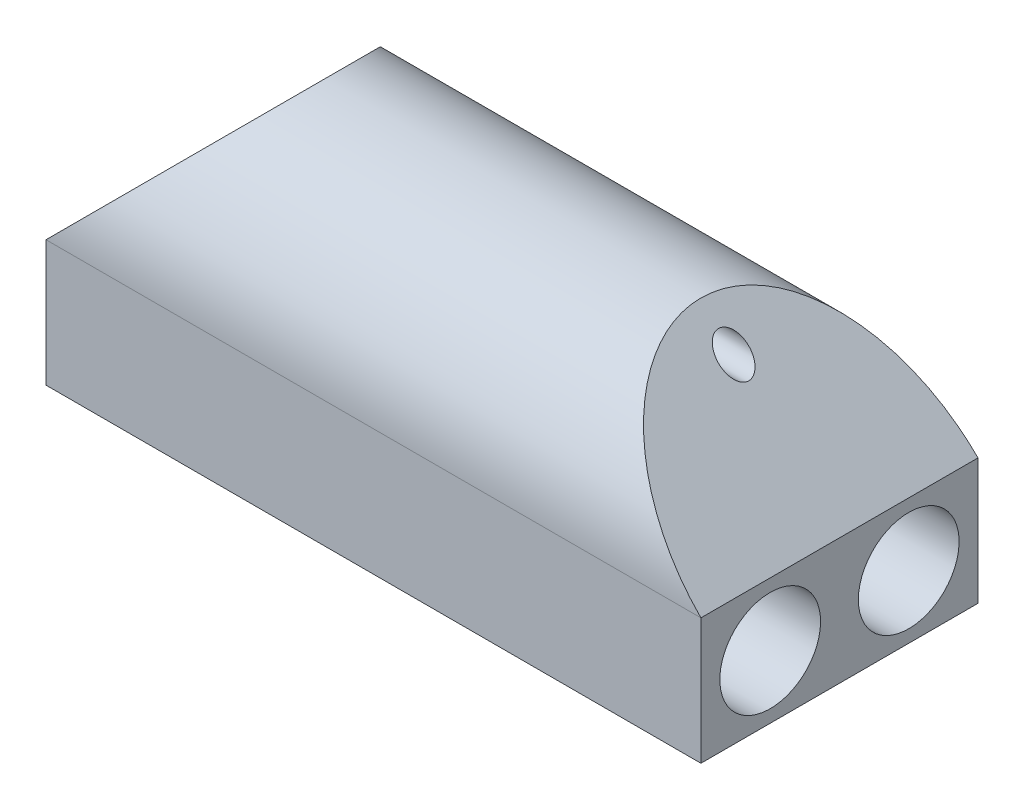
ISO-10303-21;
HEADER;
FILE_DESCRIPTION(('STEP AP214'),'2;1');
FILE_NAME('part.step','',(''),(''),'','','');
FILE_SCHEMA(('AUTOMOTIVE_DESIGN { 1 0 10303 214 1 1 1 1 }'));
ENDSEC;
DATA;
#1=APPLICATION_CONTEXT('core data for automotive mechanical design processes');
#2=APPLICATION_PROTOCOL_DEFINITION('international standard','automotive_design',2000,#1);
#3=PRODUCT_CONTEXT('',#1,'mechanical');
#4=PRODUCT('Part','Part','',(#3));
#5=PRODUCT_RELATED_PRODUCT_CATEGORY('part','',(#4));
#6=PRODUCT_DEFINITION_FORMATION('','',#4);
#7=PRODUCT_DEFINITION_CONTEXT('part definition',#1,'design');
#8=PRODUCT_DEFINITION('design','',#6,#7);
#9=PRODUCT_DEFINITION_SHAPE('','',#8);
#10=(LENGTH_UNIT() NAMED_UNIT(*) SI_UNIT(.MILLI.,.METRE.));
#11=(NAMED_UNIT(*) PLANE_ANGLE_UNIT() SI_UNIT($,.RADIAN.));
#12=(NAMED_UNIT(*) SI_UNIT($,.STERADIAN.) SOLID_ANGLE_UNIT());
#13=UNCERTAINTY_MEASURE_WITH_UNIT(LENGTH_MEASURE(1.E-05),#10,'distance_accuracy_value','');
#14=(GEOMETRIC_REPRESENTATION_CONTEXT(3) GLOBAL_UNCERTAINTY_ASSIGNED_CONTEXT((#13)) GLOBAL_UNIT_ASSIGNED_CONTEXT((#10,
#11,#12)) REPRESENTATION_CONTEXT('',''));
#15=CARTESIAN_POINT('',(0.,0.,0.));
#16=DIRECTION('',(0.,0.,1.));
#17=DIRECTION('',(1.,0.,0.));
#18=AXIS2_PLACEMENT_3D('',#15,#16,#17);
#19=CARTESIAN_POINT('',(0.,6.35,0.));
#20=DIRECTION('',(-1.,0.,0.));
#21=DIRECTION('',(0.,0.,1.));
#22=AXIS2_PLACEMENT_3D('',#19,#20,#21);
#23=PLANE('',#22);
#24=CARTESIAN_POINT('',(0.,3.175,-3.4925));
#25=DIRECTION('',(1.,0.,0.));
#26=DIRECTION('',(0.,0.,-1.));
#27=AXIS2_PLACEMENT_3D('',#24,#25,#26);
#28=CIRCLE('',#27,2.54);
#29=CARTESIAN_POINT('',(0.,3.175,-6.0325));
#30=VERTEX_POINT('',#29);
#31=EDGE_CURVE('E127',#30,#30,#28,.T.);
#32=ORIENTED_EDGE('',*,*,#31,.F.);
#33=EDGE_LOOP('',(#32));
#34=FACE_BOUND('',#33,.T.);
#35=CARTESIAN_POINT('',(0.,3.175,-10.4775));
#36=DIRECTION('',(1.,0.,0.));
#37=DIRECTION('',(0.,0.,1.));
#38=AXIS2_PLACEMENT_3D('',#35,#36,#37);
#39=CIRCLE('',#38,2.54);
#40=CARTESIAN_POINT('',(0.,3.175,-7.9375));
#41=VERTEX_POINT('',#40);
#42=EDGE_CURVE('E121',#41,#41,#39,.T.);
#43=ORIENTED_EDGE('',*,*,#42,.F.);
#44=EDGE_LOOP('',(#43));
#45=FACE_BOUND('',#44,.T.);
#46=DIRECTION('',(0.,-1.,0.));
#47=VECTOR('',#46,1.);
#48=CARTESIAN_POINT('',(0.,6.35,-13.97));
#49=LINE('',#48,#47);
#50=CARTESIAN_POINT('',(0.,6.35,-13.97));
#51=VERTEX_POINT('',#50);
#52=CARTESIAN_POINT('',(0.,0.,-13.97));
#53=VERTEX_POINT('',#52);
#54=EDGE_CURVE('E98',#51,#53,#49,.T.);
#55=ORIENTED_EDGE('',*,*,#54,.F.);
#56=DIRECTION('',(0.,0.,1.));
#57=VECTOR('',#56,1.);
#58=CARTESIAN_POINT('',(0.,6.35,-13.97));
#59=LINE('',#58,#57);
#60=CARTESIAN_POINT('',(0.,6.35,0.));
#61=VERTEX_POINT('',#60);
#62=EDGE_CURVE('E87',#51,#61,#59,.T.);
#63=ORIENTED_EDGE('',*,*,#62,.T.);
#64=DIRECTION('',(0.,-1.,0.));
#65=VECTOR('',#64,1.);
#66=CARTESIAN_POINT('',(0.,6.35,0.));
#67=LINE('',#66,#65);
#68=CARTESIAN_POINT('',(0.,0.,0.));
#69=VERTEX_POINT('',#68);
#70=EDGE_CURVE('E109',#61,#69,#67,.T.);
#71=ORIENTED_EDGE('',*,*,#70,.T.);
#72=DIRECTION('',(0.,0.,-1.));
#73=VECTOR('',#72,1.);
#74=CARTESIAN_POINT('',(0.,0.,0.));
#75=LINE('',#74,#73);
#76=EDGE_CURVE('E91',#69,#53,#75,.T.);
#77=ORIENTED_EDGE('',*,*,#76,.T.);
#78=EDGE_LOOP('',(#55,#63,#71,#77));
#79=FACE_BOUND('',#78,.T.);
#80=ADVANCED_FACE('F35',(#34,#45,#79),#23,.F.);
#81=CARTESIAN_POINT('',(0.,6.35,-13.97));
#82=DIRECTION('',(0.,0.,1.));
#83=DIRECTION('',(1.,0.,0.));
#84=AXIS2_PLACEMENT_3D('',#81,#82,#83);
#85=PLANE('',#84);
#86=DIRECTION('',(-1.,0.,0.));
#87=VECTOR('',#86,1.);
#88=CARTESIAN_POINT('',(0.,0.,-13.97));
#89=LINE('',#88,#87);
#90=CARTESIAN_POINT('',(-33.02,0.,-13.97));
#91=VERTEX_POINT('',#90);
#92=EDGE_CURVE('E113',#53,#91,#89,.T.);
#93=ORIENTED_EDGE('',*,*,#92,.T.);
#94=DIRECTION('',(0.,-1.,0.));
#95=VECTOR('',#94,1.);
#96=CARTESIAN_POINT('',(-33.02,6.35,-13.97));
#97=LINE('',#96,#95);
#98=CARTESIAN_POINT('',(-33.02,6.35,-13.97));
#99=VERTEX_POINT('',#98);
#100=EDGE_CURVE('E100',#99,#91,#97,.T.);
#101=ORIENTED_EDGE('',*,*,#100,.F.);
#102=DIRECTION('',(-1.,0.,0.));
#103=VECTOR('',#102,1.);
#104=CARTESIAN_POINT('',(0.,6.35,-13.97));
#105=LINE('',#104,#103);
#106=EDGE_CURVE('E82',#51,#99,#105,.T.);
#107=ORIENTED_EDGE('',*,*,#106,.F.);
#108=ORIENTED_EDGE('',*,*,#54,.T.);
#109=EDGE_LOOP('',(#93,#101,#107,#108));
#110=FACE_BOUND('',#109,.T.);
#111=ADVANCED_FACE('F97',(#110),#85,.F.);
#112=CARTESIAN_POINT('',(-33.02,6.35,0.));
#113=DIRECTION('',(1.,0.,0.));
#114=DIRECTION('',(0.,0.,-1.));
#115=AXIS2_PLACEMENT_3D('',#112,#113,#114);
#116=PLANE('',#115);
#117=CARTESIAN_POINT('',(-33.02,3.175,-3.4925));
#118=DIRECTION('',(1.,0.,0.));
#119=DIRECTION('',(0.,0.,-1.));
#120=AXIS2_PLACEMENT_3D('',#117,#118,#119);
#121=CIRCLE('',#120,2.54);
#122=CARTESIAN_POINT('',(-33.02,3.175,-6.0325));
#123=VERTEX_POINT('',#122);
#124=EDGE_CURVE('E130',#123,#123,#121,.T.);
#125=ORIENTED_EDGE('',*,*,#124,.T.);
#126=EDGE_LOOP('',(#125));
#127=FACE_BOUND('',#126,.T.);
#128=CARTESIAN_POINT('',(-33.02,3.175,-10.4775));
#129=DIRECTION('',(1.,0.,0.));
#130=DIRECTION('',(0.,0.,1.));
#131=AXIS2_PLACEMENT_3D('',#128,#129,#130);
#132=CIRCLE('',#131,2.54);
#133=CARTESIAN_POINT('',(-33.02,3.175,-7.9375));
#134=VERTEX_POINT('',#133);
#135=EDGE_CURVE('E124',#134,#134,#132,.T.);
#136=ORIENTED_EDGE('',*,*,#135,.T.);
#137=EDGE_LOOP('',(#136));
#138=FACE_BOUND('',#137,.T.);
#139=DIRECTION('',(0.,-1.,0.));
#140=VECTOR('',#139,1.);
#141=CARTESIAN_POINT('',(-33.02,6.35,0.));
#142=LINE('',#141,#140);
#143=CARTESIAN_POINT('',(-33.02,6.35,0.));
#144=VERTEX_POINT('',#143);
#145=CARTESIAN_POINT('',(-33.02,0.,0.));
#146=VERTEX_POINT('',#145);
#147=EDGE_CURVE('E105',#144,#146,#142,.T.);
#148=ORIENTED_EDGE('',*,*,#147,.F.);
#149=DIRECTION('',(0.,0.,1.));
#150=VECTOR('',#149,1.);
#151=CARTESIAN_POINT('',(-33.02,6.35,-13.97));
#152=LINE('',#151,#150);
#153=EDGE_CURVE('E92',#99,#144,#152,.T.);
#154=ORIENTED_EDGE('',*,*,#153,.F.);
#155=ORIENTED_EDGE('',*,*,#100,.T.);
#156=DIRECTION('',(0.,0.,1.));
#157=VECTOR('',#156,1.);
#158=CARTESIAN_POINT('',(-33.02,0.,0.));
#159=LINE('',#158,#157);
#160=EDGE_CURVE('E58',#91,#146,#159,.T.);
#161=ORIENTED_EDGE('',*,*,#160,.T.);
#162=EDGE_LOOP('',(#148,#154,#155,#161));
#163=FACE_BOUND('',#162,.T.);
#164=ADVANCED_FACE('F150',(#127,#138,#163),#116,.F.);
#165=CARTESIAN_POINT('',(0.,6.35,0.));
#166=DIRECTION('',(0.,0.,-1.));
#167=DIRECTION('',(-1.,0.,0.));
#168=AXIS2_PLACEMENT_3D('',#165,#166,#167);
#169=PLANE('',#168);
#170=DIRECTION('',(1.,0.,0.));
#171=VECTOR('',#170,1.);
#172=CARTESIAN_POINT('',(0.,0.,0.));
#173=LINE('',#172,#171);
#174=EDGE_CURVE('E50',#146,#69,#173,.T.);
#175=ORIENTED_EDGE('',*,*,#174,.T.);
#176=ORIENTED_EDGE('',*,*,#70,.F.);
#177=DIRECTION('',(1.,0.,0.));
#178=VECTOR('',#177,1.);
#179=CARTESIAN_POINT('',(0.,6.35,0.));
#180=LINE('',#179,#178);
#181=EDGE_CURVE('E84',#144,#61,#180,.T.);
#182=ORIENTED_EDGE('',*,*,#181,.F.);
#183=ORIENTED_EDGE('',*,*,#147,.T.);
#184=EDGE_LOOP('',(#175,#176,#182,#183));
#185=FACE_BOUND('',#184,.T.);
#186=ADVANCED_FACE('F151',(#185),#169,.F.);
#187=CARTESIAN_POINT('',(0.,0.,0.));
#188=DIRECTION('',(0.,1.,0.));
#189=DIRECTION('',(0.,0.,1.));
#190=AXIS2_PLACEMENT_3D('',#187,#188,#189);
#191=PLANE('',#190);
#192=ORIENTED_EDGE('',*,*,#76,.F.);
#193=ORIENTED_EDGE('',*,*,#174,.F.);
#194=ORIENTED_EDGE('',*,*,#160,.F.);
#195=ORIENTED_EDGE('',*,*,#92,.F.);
#196=EDGE_LOOP('',(#192,#193,#194,#195));
#197=FACE_BOUND('',#196,.T.);
#198=ADVANCED_FACE('F153',(#197),#191,.F.);
#199=CARTESIAN_POINT('',(-48.638934822836,6.35,-6.985));
#200=DIRECTION('',(1.,0.,0.));
#201=DIRECTION('',(0.,0.,-1.));
#202=AXIS2_PLACEMENT_3D('',#199,#200,#201);
#203=CYLINDRICAL_SURFACE('',#202,6.985);
#204=CARTESIAN_POINT('',(0.,6.35,-6.985));
#205=DIRECTION('',(-0.707106781186551,-0.707106781186544,0.));
#206=DIRECTION('',(0.707106781186544,-0.707106781186551,0.));
#207=AXIS2_PLACEMENT_3D('',#204,#205,#206);
#208=ELLIPSE('',#207,9.87828173317602,6.985);
#209=EDGE_CURVE('E11',#51,#61,#208,.F.);
#210=ORIENTED_EDGE('',*,*,#209,.F.);
#211=ORIENTED_EDGE('',*,*,#106,.T.);
#212=CARTESIAN_POINT('',(-33.02,6.35,-6.985));
#213=DIRECTION('',(0.707106781186551,-0.707106781186544,0.));
#214=DIRECTION('',(0.707106781186544,0.707106781186551,0.));
#215=AXIS2_PLACEMENT_3D('',#212,#213,#214);
#216=ELLIPSE('',#215,9.87828173317602,6.985);
#217=EDGE_CURVE('E43',#144,#99,#216,.F.);
#218=ORIENTED_EDGE('',*,*,#217,.F.);
#219=ORIENTED_EDGE('',*,*,#181,.T.);
#220=EDGE_LOOP('',(#210,#211,#218,#219));
#221=FACE_BOUND('',#220,.T.);
#222=ADVANCED_FACE('F79',(#221),#203,.T.);
#223=CARTESIAN_POINT('',(-26.0350000000001,13.335,-13.97));
#224=DIRECTION('',(0.707106781186551,-0.707106781186544,0.));
#225=DIRECTION('',(0.707106781186544,0.707106781186551,0.));
#226=AXIS2_PLACEMENT_3D('',#223,#224,#225);
#227=PLANE('',#226);
#228=CARTESIAN_POINT('',(-27.6860000000001,11.684,-6.985));
#229=DIRECTION('',(0.707106781186551,-0.707106781186544,0.));
#230=DIRECTION('',(0.707106781186544,0.707106781186551,0.));
#231=AXIS2_PLACEMENT_3D('',#228,#229,#230);
#232=ELLIPSE('',#231,1.07763073452829,0.761999999999999);
#233=CARTESIAN_POINT('',(-26.9240000000001,12.446,-6.985));
#234=VERTEX_POINT('',#233);
#235=EDGE_CURVE('E117',#234,#234,#232,.T.);
#236=ORIENTED_EDGE('',*,*,#235,.T.);
#237=EDGE_LOOP('',(#236));
#238=FACE_BOUND('',#237,.T.);
#239=ORIENTED_EDGE('',*,*,#217,.T.);
#240=ORIENTED_EDGE('',*,*,#153,.T.);
#241=EDGE_LOOP('',(#239,#240));
#242=FACE_BOUND('',#241,.T.);
#243=ADVANCED_FACE('F145',(#238,#242),#227,.F.);
#244=CARTESIAN_POINT('',(-6.98499999999993,13.335,-13.97));
#245=DIRECTION('',(-0.707106781186551,-0.707106781186544,0.));
#246=DIRECTION('',(0.707106781186544,-0.707106781186551,0.));
#247=AXIS2_PLACEMENT_3D('',#244,#245,#246);
#248=PLANE('',#247);
#249=CARTESIAN_POINT('',(-5.33399999999995,11.684,-6.985));
#250=DIRECTION('',(-0.707106781186551,-0.707106781186544,0.));
#251=DIRECTION('',(0.707106781186544,-0.707106781186551,0.));
#252=AXIS2_PLACEMENT_3D('',#249,#250,#251);
#253=ELLIPSE('',#252,1.07763073452829,0.761999999999999);
#254=CARTESIAN_POINT('',(-4.57199999999995,10.922,-6.985));
#255=VERTEX_POINT('',#254);
#256=EDGE_CURVE('E38',#255,#255,#253,.T.);
#257=ORIENTED_EDGE('',*,*,#256,.T.);
#258=EDGE_LOOP('',(#257));
#259=FACE_BOUND('',#258,.T.);
#260=ORIENTED_EDGE('',*,*,#62,.F.);
#261=ORIENTED_EDGE('',*,*,#209,.T.);
#262=EDGE_LOOP('',(#260,#261));
#263=FACE_BOUND('',#262,.T.);
#264=ADVANCED_FACE('F88',(#259,#263),#248,.F.);
#265=CARTESIAN_POINT('',(-33.02,11.684,-6.985));
#266=DIRECTION('',(1.,0.,0.));
#267=DIRECTION('',(0.,0.,-1.));
#268=AXIS2_PLACEMENT_3D('',#265,#266,#267);
#269=CYLINDRICAL_SURFACE('',#268,0.761999999999999);
#270=ORIENTED_EDGE('',*,*,#256,.F.);
#271=EDGE_LOOP('',(#270));
#272=FACE_BOUND('',#271,.T.);
#273=ORIENTED_EDGE('',*,*,#235,.F.);
#274=EDGE_LOOP('',(#273));
#275=FACE_BOUND('',#274,.T.);
#276=ADVANCED_FACE('F138',(#272,#275),#269,.F.);
#277=CARTESIAN_POINT('',(-33.02,3.175,-10.4775));
#278=DIRECTION('',(1.,0.,0.));
#279=DIRECTION('',(0.,0.,-1.));
#280=AXIS2_PLACEMENT_3D('',#277,#278,#279);
#281=CYLINDRICAL_SURFACE('',#280,2.54);
#282=ORIENTED_EDGE('',*,*,#135,.F.);
#283=EDGE_LOOP('',(#282));
#284=FACE_BOUND('',#283,.T.);
#285=ORIENTED_EDGE('',*,*,#42,.T.);
#286=EDGE_LOOP('',(#285));
#287=FACE_BOUND('',#286,.T.);
#288=ADVANCED_FACE('F141',(#284,#287),#281,.F.);
#289=CARTESIAN_POINT('',(-33.02,3.175,-3.4925));
#290=DIRECTION('',(1.,0.,0.));
#291=DIRECTION('',(0.,0.,-1.));
#292=AXIS2_PLACEMENT_3D('',#289,#290,#291);
#293=CYLINDRICAL_SURFACE('',#292,2.54);
#294=ORIENTED_EDGE('',*,*,#124,.F.);
#295=EDGE_LOOP('',(#294));
#296=FACE_BOUND('',#295,.T.);
#297=ORIENTED_EDGE('',*,*,#31,.T.);
#298=EDGE_LOOP('',(#297));
#299=FACE_BOUND('',#298,.T.);
#300=ADVANCED_FACE('F172',(#296,#299),#293,.F.);
#301=CLOSED_SHELL('',(#80,#111,#164,#186,#198,#222,#243,#264,#276,#288,#300));
#302=MANIFOLD_SOLID_BREP('B2',#301);
#303=ADVANCED_BREP_SHAPE_REPRESENTATION('',(#18,#302),#14);
#304=SHAPE_DEFINITION_REPRESENTATION(#9,#303);
ENDSEC;
END-ISO-10303-21;
